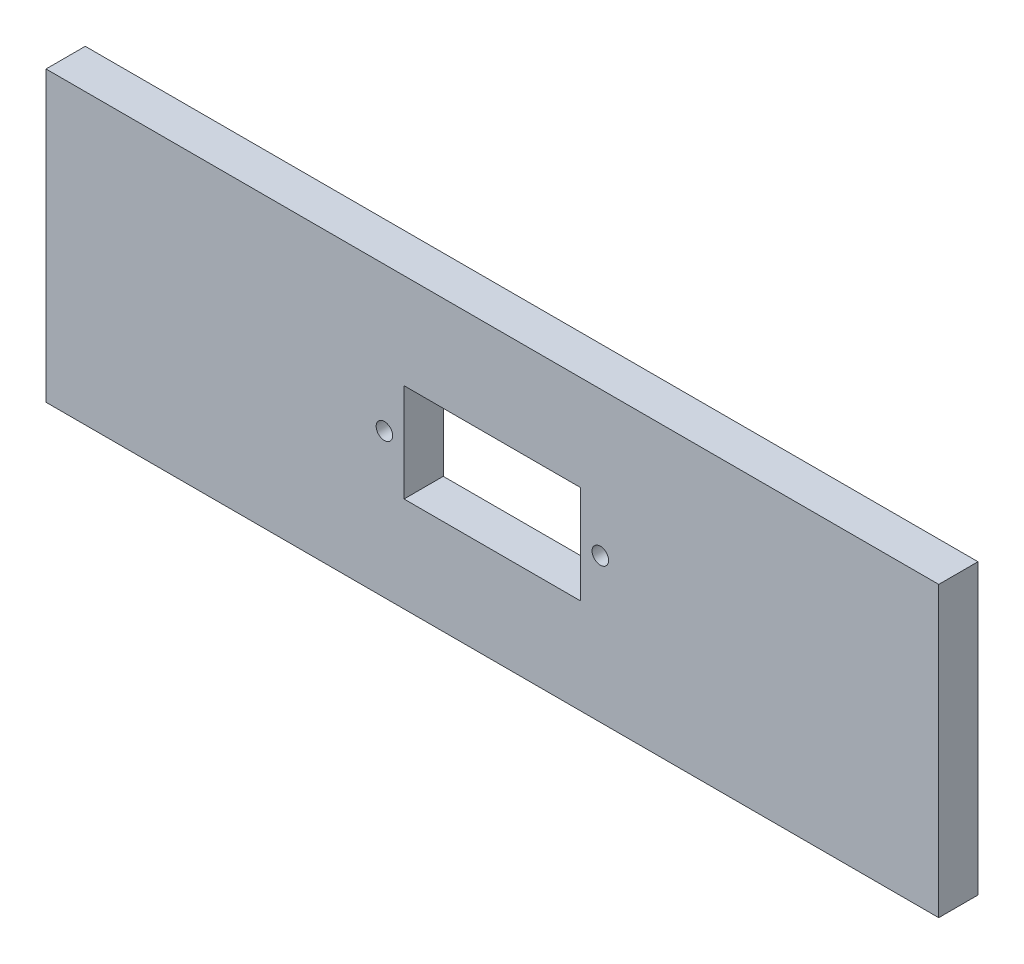
ISO-10303-21;
HEADER;
FILE_DESCRIPTION(('STEP AP214'),'2;1');
FILE_NAME('part.step','',(''),(''),'','','');
FILE_SCHEMA(('AUTOMOTIVE_DESIGN { 1 0 10303 214 1 1 1 1 }'));
ENDSEC;
DATA;
#1=APPLICATION_CONTEXT('core data for automotive mechanical design processes');
#2=APPLICATION_PROTOCOL_DEFINITION('international standard','automotive_design',2000,#1);
#3=PRODUCT_CONTEXT('',#1,'mechanical');
#4=PRODUCT('Part','Part','',(#3));
#5=PRODUCT_RELATED_PRODUCT_CATEGORY('part','',(#4));
#6=PRODUCT_DEFINITION_FORMATION('','',#4);
#7=PRODUCT_DEFINITION_CONTEXT('part definition',#1,'design');
#8=PRODUCT_DEFINITION('design','',#6,#7);
#9=PRODUCT_DEFINITION_SHAPE('','',#8);
#10=(LENGTH_UNIT() NAMED_UNIT(*) SI_UNIT(.MILLI.,.METRE.));
#11=(NAMED_UNIT(*) PLANE_ANGLE_UNIT() SI_UNIT($,.RADIAN.));
#12=(NAMED_UNIT(*) SI_UNIT($,.STERADIAN.) SOLID_ANGLE_UNIT());
#13=UNCERTAINTY_MEASURE_WITH_UNIT(LENGTH_MEASURE(1.E-05),#10,'distance_accuracy_value','');
#14=(GEOMETRIC_REPRESENTATION_CONTEXT(3) GLOBAL_UNCERTAINTY_ASSIGNED_CONTEXT((#13)) GLOBAL_UNIT_ASSIGNED_CONTEXT((#10,
#11,#12)) REPRESENTATION_CONTEXT('',''));
#15=CARTESIAN_POINT('',(0.,0.,0.));
#16=DIRECTION('',(0.,0.,1.));
#17=DIRECTION('',(1.,0.,0.));
#18=AXIS2_PLACEMENT_3D('',#15,#16,#17);
#19=CARTESIAN_POINT('',(0.,0.,5.));
#20=DIRECTION('',(0.,0.,1.));
#21=DIRECTION('',(1.,0.,0.));
#22=AXIS2_PLACEMENT_3D('',#19,#20,#21);
#23=PLANE('',#22);
#24=CARTESIAN_POINT('',(-13.75,0.,5.));
#25=DIRECTION('',(0.,0.,1.));
#26=DIRECTION('',(1.,0.,0.));
#27=AXIS2_PLACEMENT_3D('',#24,#25,#26);
#28=CIRCLE('',#27,1.05);
#29=CARTESIAN_POINT('',(-12.7,0.,5.));
#30=VERTEX_POINT('',#29);
#31=EDGE_CURVE('E127',#30,#30,#28,.T.);
#32=ORIENTED_EDGE('',*,*,#31,.F.);
#33=EDGE_LOOP('',(#32));
#34=FACE_BOUND('',#33,.T.);
#35=DIRECTION('',(0.,1.,0.));
#36=VECTOR('',#35,1.);
#37=CARTESIAN_POINT('',(56.8440716655312,18.380717784064,5.));
#38=LINE('',#37,#36);
#39=CARTESIAN_POINT('',(56.8440716655312,-18.380717784064,5.));
#40=VERTEX_POINT('',#39);
#41=CARTESIAN_POINT('',(56.8440716655312,18.380717784064,5.));
#42=VERTEX_POINT('',#41);
#43=EDGE_CURVE('E137',#40,#42,#38,.T.);
#44=ORIENTED_EDGE('',*,*,#43,.T.);
#45=DIRECTION('',(-1.,0.,0.));
#46=VECTOR('',#45,1.);
#47=CARTESIAN_POINT('',(-56.8440716655312,18.380717784064,5.));
#48=LINE('',#47,#46);
#49=CARTESIAN_POINT('',(-56.8440716655312,18.380717784064,5.));
#50=VERTEX_POINT('',#49);
#51=EDGE_CURVE('E140',#42,#50,#48,.T.);
#52=ORIENTED_EDGE('',*,*,#51,.T.);
#53=DIRECTION('',(0.,-1.,0.));
#54=VECTOR('',#53,1.);
#55=CARTESIAN_POINT('',(-56.8440716655312,18.380717784064,5.));
#56=LINE('',#55,#54);
#57=CARTESIAN_POINT('',(-56.8440716655312,-18.380717784064,5.));
#58=VERTEX_POINT('',#57);
#59=EDGE_CURVE('E143',#50,#58,#56,.T.);
#60=ORIENTED_EDGE('',*,*,#59,.T.);
#61=DIRECTION('',(1.,0.,0.));
#62=VECTOR('',#61,1.);
#63=CARTESIAN_POINT('',(-56.8440716655312,-18.380717784064,5.));
#64=LINE('',#63,#62);
#65=EDGE_CURVE('E145',#58,#40,#64,.T.);
#66=ORIENTED_EDGE('',*,*,#65,.T.);
#67=EDGE_LOOP('',(#44,#52,#60,#66));
#68=FACE_BOUND('',#67,.T.);
#69=DIRECTION('',(1.,0.,0.));
#70=VECTOR('',#69,1.);
#71=CARTESIAN_POINT('',(11.25,-6.25,5.));
#72=LINE('',#71,#70);
#73=CARTESIAN_POINT('',(-11.25,-6.25,5.));
#74=VERTEX_POINT('',#73);
#75=CARTESIAN_POINT('',(11.25,-6.25,5.));
#76=VERTEX_POINT('',#75);
#77=EDGE_CURVE('E106',#74,#76,#72,.T.);
#78=ORIENTED_EDGE('',*,*,#77,.F.);
#79=DIRECTION('',(0.,-1.,0.));
#80=VECTOR('',#79,1.);
#81=CARTESIAN_POINT('',(-11.25,6.25,5.));
#82=LINE('',#81,#80);
#83=CARTESIAN_POINT('',(-11.25,6.25,5.));
#84=VERTEX_POINT('',#83);
#85=EDGE_CURVE('E98',#84,#74,#82,.T.);
#86=ORIENTED_EDGE('',*,*,#85,.F.);
#87=DIRECTION('',(-1.,0.,0.));
#88=VECTOR('',#87,1.);
#89=CARTESIAN_POINT('',(11.25,6.25,5.));
#90=LINE('',#89,#88);
#91=CARTESIAN_POINT('',(11.25,6.25,5.));
#92=VERTEX_POINT('',#91);
#93=EDGE_CURVE('E121',#92,#84,#90,.T.);
#94=ORIENTED_EDGE('',*,*,#93,.F.);
#95=DIRECTION('',(0.,1.,0.));
#96=VECTOR('',#95,1.);
#97=CARTESIAN_POINT('',(11.25,6.25,5.));
#98=LINE('',#97,#96);
#99=EDGE_CURVE('E119',#76,#92,#98,.T.);
#100=ORIENTED_EDGE('',*,*,#99,.F.);
#101=EDGE_LOOP('',(#78,#86,#94,#100));
#102=FACE_BOUND('',#101,.T.);
#103=CARTESIAN_POINT('',(13.75,0.,5.));
#104=DIRECTION('',(0.,0.,1.));
#105=DIRECTION('',(1.,0.,0.));
#106=AXIS2_PLACEMENT_3D('',#103,#104,#105);
#107=CIRCLE('',#106,1.05);
#108=CARTESIAN_POINT('',(14.8,0.,5.));
#109=VERTEX_POINT('',#108);
#110=EDGE_CURVE('E227',#109,#109,#107,.T.);
#111=ORIENTED_EDGE('',*,*,#110,.F.);
#112=EDGE_LOOP('',(#111));
#113=FACE_BOUND('',#112,.T.);
#114=ADVANCED_FACE('F33',(#34,#68,#102,#113),#23,.T.);
#115=CARTESIAN_POINT('',(0.,0.,0.));
#116=DIRECTION('',(0.,0.,1.));
#117=DIRECTION('',(1.,0.,0.));
#118=AXIS2_PLACEMENT_3D('',#115,#116,#117);
#119=PLANE('',#118);
#120=DIRECTION('',(0.,1.,0.));
#121=VECTOR('',#120,1.);
#122=CARTESIAN_POINT('',(56.8440716655312,18.380717784064,0.));
#123=LINE('',#122,#121);
#124=CARTESIAN_POINT('',(56.8440716655312,-18.380717784064,0.));
#125=VERTEX_POINT('',#124);
#126=CARTESIAN_POINT('',(56.8440716655312,18.380717784064,0.));
#127=VERTEX_POINT('',#126);
#128=EDGE_CURVE('E114',#125,#127,#123,.T.);
#129=ORIENTED_EDGE('',*,*,#128,.F.);
#130=DIRECTION('',(1.,0.,0.));
#131=VECTOR('',#130,1.);
#132=CARTESIAN_POINT('',(-56.8440716655312,-18.380717784064,0.));
#133=LINE('',#132,#131);
#134=CARTESIAN_POINT('',(-56.8440716655312,-18.380717784064,0.));
#135=VERTEX_POINT('',#134);
#136=EDGE_CURVE('E141',#135,#125,#133,.T.);
#137=ORIENTED_EDGE('',*,*,#136,.F.);
#138=DIRECTION('',(0.,-1.,0.));
#139=VECTOR('',#138,1.);
#140=CARTESIAN_POINT('',(-56.8440716655312,18.380717784064,0.));
#141=LINE('',#140,#139);
#142=CARTESIAN_POINT('',(-56.8440716655312,18.380717784064,0.));
#143=VERTEX_POINT('',#142);
#144=EDGE_CURVE('E152',#143,#135,#141,.T.);
#145=ORIENTED_EDGE('',*,*,#144,.F.);
#146=DIRECTION('',(-1.,0.,0.));
#147=VECTOR('',#146,1.);
#148=CARTESIAN_POINT('',(-56.8440716655312,18.380717784064,0.));
#149=LINE('',#148,#147);
#150=EDGE_CURVE('E150',#127,#143,#149,.T.);
#151=ORIENTED_EDGE('',*,*,#150,.F.);
#152=EDGE_LOOP('',(#129,#137,#145,#151));
#153=FACE_BOUND('',#152,.T.);
#154=DIRECTION('',(0.,-1.,0.));
#155=VECTOR('',#154,1.);
#156=CARTESIAN_POINT('',(-11.25,6.25,0.));
#157=LINE('',#156,#155);
#158=CARTESIAN_POINT('',(-11.25,6.25,0.));
#159=VERTEX_POINT('',#158);
#160=CARTESIAN_POINT('',(-11.25,-6.25,0.));
#161=VERTEX_POINT('',#160);
#162=EDGE_CURVE('E56',#159,#161,#157,.T.);
#163=ORIENTED_EDGE('',*,*,#162,.T.);
#164=DIRECTION('',(1.,0.,0.));
#165=VECTOR('',#164,1.);
#166=CARTESIAN_POINT('',(11.25,-6.25,0.));
#167=LINE('',#166,#165);
#168=CARTESIAN_POINT('',(11.25,-6.25,0.));
#169=VERTEX_POINT('',#168);
#170=EDGE_CURVE('E113',#161,#169,#167,.T.);
#171=ORIENTED_EDGE('',*,*,#170,.T.);
#172=DIRECTION('',(0.,1.,0.));
#173=VECTOR('',#172,1.);
#174=CARTESIAN_POINT('',(11.25,6.25,0.));
#175=LINE('',#174,#173);
#176=CARTESIAN_POINT('',(11.25,6.25,0.));
#177=VERTEX_POINT('',#176);
#178=EDGE_CURVE('E129',#169,#177,#175,.T.);
#179=ORIENTED_EDGE('',*,*,#178,.T.);
#180=DIRECTION('',(-1.,0.,0.));
#181=VECTOR('',#180,1.);
#182=CARTESIAN_POINT('',(11.25,6.25,0.));
#183=LINE('',#182,#181);
#184=EDGE_CURVE('E107',#177,#159,#183,.T.);
#185=ORIENTED_EDGE('',*,*,#184,.T.);
#186=EDGE_LOOP('',(#163,#171,#179,#185));
#187=FACE_BOUND('',#186,.T.);
#188=CARTESIAN_POINT('',(-13.75,0.,0.));
#189=DIRECTION('',(0.,0.,1.));
#190=DIRECTION('',(1.,0.,0.));
#191=AXIS2_PLACEMENT_3D('',#188,#189,#190);
#192=CIRCLE('',#191,1.05);
#193=CARTESIAN_POINT('',(-12.7,0.,0.));
#194=VERTEX_POINT('',#193);
#195=EDGE_CURVE('E233',#194,#194,#192,.T.);
#196=ORIENTED_EDGE('',*,*,#195,.T.);
#197=EDGE_LOOP('',(#196));
#198=FACE_BOUND('',#197,.T.);
#199=CARTESIAN_POINT('',(13.75,0.,0.));
#200=DIRECTION('',(0.,0.,1.));
#201=DIRECTION('',(1.,0.,0.));
#202=AXIS2_PLACEMENT_3D('',#199,#200,#201);
#203=CIRCLE('',#202,1.05);
#204=CARTESIAN_POINT('',(14.8,0.,0.));
#205=VERTEX_POINT('',#204);
#206=EDGE_CURVE('E230',#205,#205,#203,.T.);
#207=ORIENTED_EDGE('',*,*,#206,.T.);
#208=EDGE_LOOP('',(#207));
#209=FACE_BOUND('',#208,.T.);
#210=ADVANCED_FACE('F170',(#153,#187,#198,#209),#119,.F.);
#211=CARTESIAN_POINT('',(56.8440716655312,18.380717784064,5.));
#212=DIRECTION('',(-1.,0.,0.));
#213=DIRECTION('',(0.,0.,1.));
#214=AXIS2_PLACEMENT_3D('',#211,#212,#213);
#215=PLANE('',#214);
#216=ORIENTED_EDGE('',*,*,#128,.T.);
#217=DIRECTION('',(0.,0.,-1.));
#218=VECTOR('',#217,1.);
#219=CARTESIAN_POINT('',(56.8440716655312,18.380717784064,5.));
#220=LINE('',#219,#218);
#221=EDGE_CURVE('E11',#42,#127,#220,.T.);
#222=ORIENTED_EDGE('',*,*,#221,.F.);
#223=ORIENTED_EDGE('',*,*,#43,.F.);
#224=DIRECTION('',(0.,0.,-1.));
#225=VECTOR('',#224,1.);
#226=CARTESIAN_POINT('',(56.8440716655312,-18.380717784064,5.));
#227=LINE('',#226,#225);
#228=EDGE_CURVE('E147',#40,#125,#227,.T.);
#229=ORIENTED_EDGE('',*,*,#228,.T.);
#230=EDGE_LOOP('',(#216,#222,#223,#229));
#231=FACE_BOUND('',#230,.T.);
#232=ADVANCED_FACE('F35',(#231),#215,.F.);
#233=CARTESIAN_POINT('',(-56.8440716655312,18.380717784064,5.));
#234=DIRECTION('',(0.,-1.,0.));
#235=DIRECTION('',(0.,0.,-1.));
#236=AXIS2_PLACEMENT_3D('',#233,#234,#235);
#237=PLANE('',#236);
#238=ORIENTED_EDGE('',*,*,#150,.T.);
#239=DIRECTION('',(0.,0.,-1.));
#240=VECTOR('',#239,1.);
#241=CARTESIAN_POINT('',(-56.8440716655312,18.380717784064,5.));
#242=LINE('',#241,#240);
#243=EDGE_CURVE('E41',#50,#143,#242,.T.);
#244=ORIENTED_EDGE('',*,*,#243,.F.);
#245=ORIENTED_EDGE('',*,*,#51,.F.);
#246=ORIENTED_EDGE('',*,*,#221,.T.);
#247=EDGE_LOOP('',(#238,#244,#245,#246));
#248=FACE_BOUND('',#247,.T.);
#249=ADVANCED_FACE('F180',(#248),#237,.F.);
#250=CARTESIAN_POINT('',(-56.8440716655312,18.380717784064,5.));
#251=DIRECTION('',(1.,0.,0.));
#252=DIRECTION('',(0.,0.,-1.));
#253=AXIS2_PLACEMENT_3D('',#250,#251,#252);
#254=PLANE('',#253);
#255=ORIENTED_EDGE('',*,*,#144,.T.);
#256=DIRECTION('',(0.,0.,-1.));
#257=VECTOR('',#256,1.);
#258=CARTESIAN_POINT('',(-56.8440716655312,-18.380717784064,5.));
#259=LINE('',#258,#257);
#260=EDGE_CURVE('E157',#58,#135,#259,.T.);
#261=ORIENTED_EDGE('',*,*,#260,.F.);
#262=ORIENTED_EDGE('',*,*,#59,.F.);
#263=ORIENTED_EDGE('',*,*,#243,.T.);
#264=EDGE_LOOP('',(#255,#261,#262,#263));
#265=FACE_BOUND('',#264,.T.);
#266=ADVANCED_FACE('F164',(#265),#254,.F.);
#267=CARTESIAN_POINT('',(-56.8440716655312,-18.380717784064,5.));
#268=DIRECTION('',(0.,1.,0.));
#269=DIRECTION('',(0.,0.,1.));
#270=AXIS2_PLACEMENT_3D('',#267,#268,#269);
#271=PLANE('',#270);
#272=ORIENTED_EDGE('',*,*,#136,.T.);
#273=ORIENTED_EDGE('',*,*,#228,.F.);
#274=ORIENTED_EDGE('',*,*,#65,.F.);
#275=ORIENTED_EDGE('',*,*,#260,.T.);
#276=EDGE_LOOP('',(#272,#273,#274,#275));
#277=FACE_BOUND('',#276,.T.);
#278=ADVANCED_FACE('F174',(#277),#271,.F.);
#279=CARTESIAN_POINT('',(-11.25,6.25,5.));
#280=DIRECTION('',(1.,0.,0.));
#281=DIRECTION('',(0.,1.,0.));
#282=AXIS2_PLACEMENT_3D('',#279,#280,#281);
#283=PLANE('',#282);
#284=ORIENTED_EDGE('',*,*,#162,.F.);
#285=DIRECTION('',(0.,0.,-1.));
#286=VECTOR('',#285,1.);
#287=CARTESIAN_POINT('',(-11.25,6.25,5.));
#288=LINE('',#287,#286);
#289=EDGE_CURVE('E102',#84,#159,#288,.T.);
#290=ORIENTED_EDGE('',*,*,#289,.F.);
#291=ORIENTED_EDGE('',*,*,#85,.T.);
#292=DIRECTION('',(0.,0.,-1.));
#293=VECTOR('',#292,1.);
#294=CARTESIAN_POINT('',(-11.25,-6.25,5.));
#295=LINE('',#294,#293);
#296=EDGE_CURVE('E101',#74,#161,#295,.T.);
#297=ORIENTED_EDGE('',*,*,#296,.T.);
#298=EDGE_LOOP('',(#284,#290,#291,#297));
#299=FACE_BOUND('',#298,.T.);
#300=ADVANCED_FACE('F100',(#299),#283,.T.);
#301=CARTESIAN_POINT('',(11.25,-6.25,5.));
#302=DIRECTION('',(0.,1.,0.));
#303=DIRECTION('',(-1.,0.,0.));
#304=AXIS2_PLACEMENT_3D('',#301,#302,#303);
#305=PLANE('',#304);
#306=ORIENTED_EDGE('',*,*,#170,.F.);
#307=ORIENTED_EDGE('',*,*,#296,.F.);
#308=ORIENTED_EDGE('',*,*,#77,.T.);
#309=DIRECTION('',(0.,0.,-1.));
#310=VECTOR('',#309,1.);
#311=CARTESIAN_POINT('',(11.25,-6.25,5.));
#312=LINE('',#311,#310);
#313=EDGE_CURVE('E115',#76,#169,#312,.T.);
#314=ORIENTED_EDGE('',*,*,#313,.T.);
#315=EDGE_LOOP('',(#306,#307,#308,#314));
#316=FACE_BOUND('',#315,.T.);
#317=ADVANCED_FACE('F110',(#316),#305,.T.);
#318=CARTESIAN_POINT('',(11.25,6.25,5.));
#319=DIRECTION('',(-1.,0.,0.));
#320=DIRECTION('',(0.,0.,1.));
#321=AXIS2_PLACEMENT_3D('',#318,#319,#320);
#322=PLANE('',#321);
#323=ORIENTED_EDGE('',*,*,#178,.F.);
#324=ORIENTED_EDGE('',*,*,#313,.F.);
#325=ORIENTED_EDGE('',*,*,#99,.T.);
#326=DIRECTION('',(0.,0.,-1.));
#327=VECTOR('',#326,1.);
#328=CARTESIAN_POINT('',(11.25,6.25,5.));
#329=LINE('',#328,#327);
#330=EDGE_CURVE('E48',#92,#177,#329,.T.);
#331=ORIENTED_EDGE('',*,*,#330,.T.);
#332=EDGE_LOOP('',(#323,#324,#325,#331));
#333=FACE_BOUND('',#332,.T.);
#334=ADVANCED_FACE('F205',(#333),#322,.T.);
#335=CARTESIAN_POINT('',(11.25,6.25,5.));
#336=DIRECTION('',(0.,-1.,0.));
#337=DIRECTION('',(1.,0.,0.));
#338=AXIS2_PLACEMENT_3D('',#335,#336,#337);
#339=PLANE('',#338);
#340=ORIENTED_EDGE('',*,*,#184,.F.);
#341=ORIENTED_EDGE('',*,*,#330,.F.);
#342=ORIENTED_EDGE('',*,*,#93,.T.);
#343=ORIENTED_EDGE('',*,*,#289,.T.);
#344=EDGE_LOOP('',(#340,#341,#342,#343));
#345=FACE_BOUND('',#344,.T.);
#346=ADVANCED_FACE('F209',(#345),#339,.T.);
#347=CARTESIAN_POINT('',(-13.75,0.,5.));
#348=DIRECTION('',(0.,0.,-1.));
#349=DIRECTION('',(-1.,0.,0.));
#350=AXIS2_PLACEMENT_3D('',#347,#348,#349);
#351=CYLINDRICAL_SURFACE('',#350,1.05);
#352=ORIENTED_EDGE('',*,*,#31,.T.);
#353=EDGE_LOOP('',(#352));
#354=FACE_BOUND('',#353,.T.);
#355=ORIENTED_EDGE('',*,*,#195,.F.);
#356=EDGE_LOOP('',(#355));
#357=FACE_BOUND('',#356,.T.);
#358=ADVANCED_FACE('F215',(#354,#357),#351,.F.);
#359=CARTESIAN_POINT('',(13.75,0.,5.));
#360=DIRECTION('',(0.,0.,-1.));
#361=DIRECTION('',(-1.,0.,0.));
#362=AXIS2_PLACEMENT_3D('',#359,#360,#361);
#363=CYLINDRICAL_SURFACE('',#362,1.05);
#364=ORIENTED_EDGE('',*,*,#110,.T.);
#365=EDGE_LOOP('',(#364));
#366=FACE_BOUND('',#365,.T.);
#367=ORIENTED_EDGE('',*,*,#206,.F.);
#368=EDGE_LOOP('',(#367));
#369=FACE_BOUND('',#368,.T.);
#370=ADVANCED_FACE('F218',(#366,#369),#363,.F.);
#371=CLOSED_SHELL('',(#114,#210,#232,#249,#266,#278,#300,#317,#334,#346,#358,#370));
#372=MANIFOLD_SOLID_BREP('B2',#371);
#373=ADVANCED_BREP_SHAPE_REPRESENTATION('',(#18,#372),#14);
#374=SHAPE_DEFINITION_REPRESENTATION(#9,#373);
ENDSEC;
END-ISO-10303-21;
